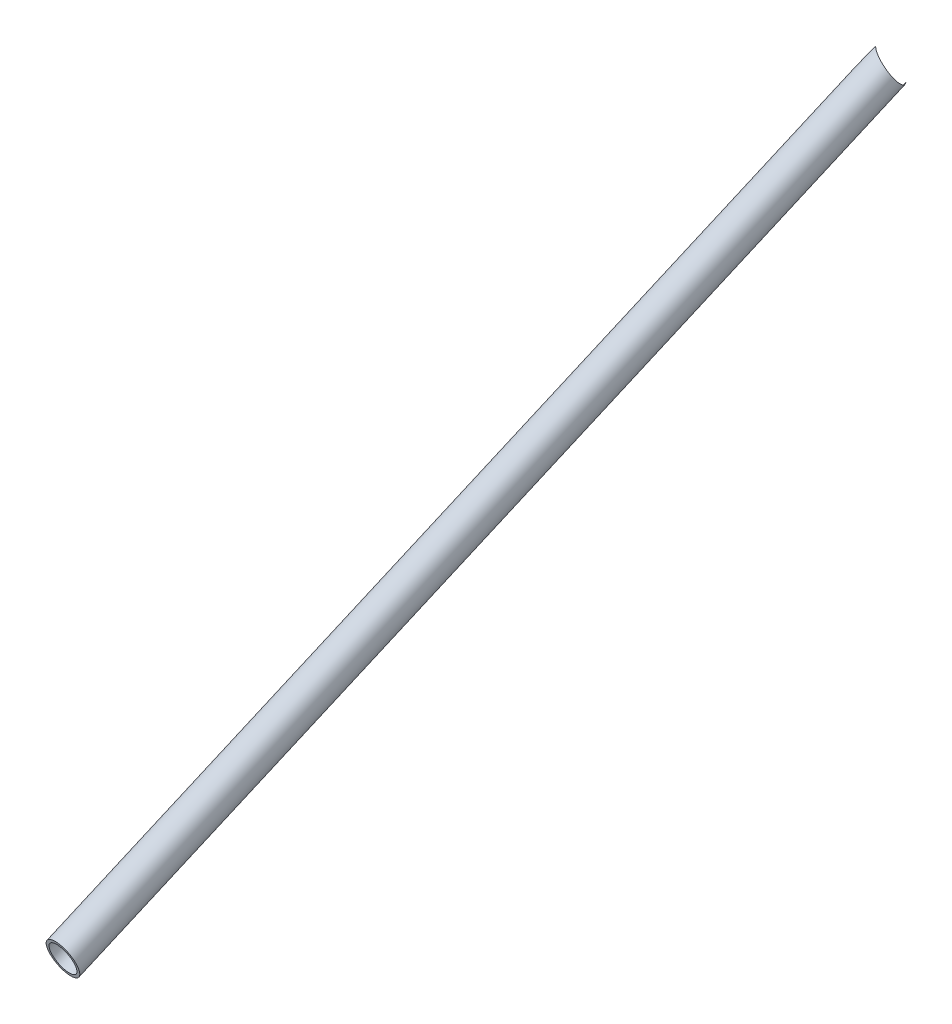
ISO-10303-21;
HEADER;
FILE_DESCRIPTION(('STEP AP214'),'2;1');
FILE_NAME('part.step','',(''),(''),'','','');
FILE_SCHEMA(('AUTOMOTIVE_DESIGN { 1 0 10303 214 1 1 1 1 }'));
ENDSEC;
DATA;
#1=APPLICATION_CONTEXT('core data for automotive mechanical design processes');
#2=APPLICATION_PROTOCOL_DEFINITION('international standard','automotive_design',2000,#1);
#3=PRODUCT_CONTEXT('',#1,'mechanical');
#4=PRODUCT('Part','Part','',(#3));
#5=PRODUCT_RELATED_PRODUCT_CATEGORY('part','',(#4));
#6=PRODUCT_DEFINITION_FORMATION('','',#4);
#7=PRODUCT_DEFINITION_CONTEXT('part definition',#1,'design');
#8=PRODUCT_DEFINITION('design','',#6,#7);
#9=PRODUCT_DEFINITION_SHAPE('','',#8);
#10=(LENGTH_UNIT() NAMED_UNIT(*) SI_UNIT(.MILLI.,.METRE.));
#11=(NAMED_UNIT(*) PLANE_ANGLE_UNIT() SI_UNIT($,.RADIAN.));
#12=(NAMED_UNIT(*) SI_UNIT($,.STERADIAN.) SOLID_ANGLE_UNIT());
#13=UNCERTAINTY_MEASURE_WITH_UNIT(LENGTH_MEASURE(1.E-05),#10,'distance_accuracy_value','');
#14=(GEOMETRIC_REPRESENTATION_CONTEXT(3) GLOBAL_UNCERTAINTY_ASSIGNED_CONTEXT((#13)) GLOBAL_UNIT_ASSIGNED_CONTEXT((#10,
#11,#12)) REPRESENTATION_CONTEXT('',''));
#15=CARTESIAN_POINT('',(0.,0.,0.));
#16=DIRECTION('',(0.,0.,1.));
#17=DIRECTION('',(1.,0.,0.));
#18=AXIS2_PLACEMENT_3D('',#15,#16,#17);
#19=CARTESIAN_POINT('',(-80.,380.,-601.037933611912));
#20=DIRECTION('',(-0.143388493553694,0.215082740330541,-0.966011984774675));
#21=DIRECTION('',(0.,0.976098519192531,0.21732850901377));
#22=AXIS2_PLACEMENT_3D('',#19,#20,#21);
#23=CYLINDRICAL_SURFACE('',#22,7.9);
#24=CARTESIAN_POINT('',(-158.980874678796,506.182490319815,-1131.41723116599));
#25=CARTESIAN_POINT('',(-158.748422493416,506.165280859311,-1131.33993661921));
#26=CARTESIAN_POINT('',(-158.51578375334,506.139324978695,-1131.26509855469));
#27=CARTESIAN_POINT('',(-158.05085961624,506.070144264024,-1131.12248687499));
#28=CARTESIAN_POINT('',(-157.818574273701,506.026916993956,-1131.05471425805));
#29=CARTESIAN_POINT('',(-157.355550379285,505.923232034948,-1130.92830625368));
#30=CARTESIAN_POINT('',(-157.124810730168,505.862788282871,-1130.86966353468));
#31=CARTESIAN_POINT('',(-156.665911350362,505.724513110719,-1130.76338194598));
#32=CARTESIAN_POINT('',(-156.437752163581,505.646678094134,-1130.71574535649));
#33=CARTESIAN_POINT('',(-156.026769345198,505.489234732048,-1130.6408697576));
#34=CARTESIAN_POINT('',(-155.843227857469,505.412507874493,-1130.61149830341));
#35=CARTESIAN_POINT('',(-155.480176339785,505.247346196125,-1130.56242663865));
#36=CARTESIAN_POINT('',(-155.300665475829,505.158913823976,-1130.54272440944));
#37=CARTESIAN_POINT('',(-154.947019554601,504.970486222036,-1130.51393818097));
#38=CARTESIAN_POINT('',(-154.772882070556,504.870496311742,-1130.50484931801));
#39=CARTESIAN_POINT('',(-154.431351834594,504.659200302302,-1130.49811183827));
#40=CARTESIAN_POINT('',(-154.263959132532,504.547894119533,-1130.50046330604));
#41=CARTESIAN_POINT('',(-153.936241727853,504.313565625078,-1130.51734529632));
#42=CARTESIAN_POINT('',(-153.775981532379,504.190459533921,-1130.53196965801));
#43=CARTESIAN_POINT('',(-153.465592539831,503.934040319588,-1130.57397207918));
#44=CARTESIAN_POINT('',(-153.315463804903,503.80072713381,-1130.60135021688));
#45=CARTESIAN_POINT('',(-153.027043537964,503.525016903228,-1130.66899273393));
#46=CARTESIAN_POINT('',(-152.888745985319,503.382624543787,-1130.70925050908));
#47=CARTESIAN_POINT('',(-152.625380845683,503.089993327712,-1130.8024678954));
#48=CARTESIAN_POINT('',(-152.500311750817,502.939755368299,-1130.85542605665));
#49=CARTESIAN_POINT('',(-152.279304778547,502.652048956018,-1130.96613726054));
#50=CARTESIAN_POINT('',(-152.181679051578,502.51532409052,-1131.02246907334));
#51=CARTESIAN_POINT('',(-151.9980581041,502.238012274893,-1131.14390223665));
#52=CARTESIAN_POINT('',(-151.9120629603,502.097425299299,-1131.209003645));
#53=CARTESIAN_POINT('',(-151.752091172815,501.813429684816,-1131.34727674451));
#54=CARTESIAN_POINT('',(-151.678114306358,501.670021098283,-1131.42044828605));
#55=CARTESIAN_POINT('',(-151.542340435112,501.381352532155,-1131.57406252496));
#56=CARTESIAN_POINT('',(-151.480544041078,501.236092460111,-1131.65450558663));
#57=CARTESIAN_POINT('',(-151.3683500505,500.942604931388,-1131.82295228781));
#58=CARTESIAN_POINT('',(-151.318120710568,500.794364123856,-1131.91104461104));
#59=CARTESIAN_POINT('',(-151.22996771825,500.497679938698,-1132.09289594302));
#60=CARTESIAN_POINT('',(-151.192048575173,500.349236506799,-1132.18665701337));
#61=CARTESIAN_POINT('',(-151.096363174337,499.904678060465,-1132.47505258995));
#62=CARTESIAN_POINT('',(-151.056604931555,499.609164363024,-1132.67689847923));
#63=CARTESIAN_POINT('',(-151.027009318083,499.108030467565,-1133.03282549319));
#64=CARTESIAN_POINT('',(-151.026150614893,498.900861011108,-1133.18406703947));
#65=CARTESIAN_POINT('',(-151.046081154677,498.490203092574,-1133.49027918341));
#66=CARTESIAN_POINT('',(-151.066878375311,498.286716015123,-1133.64525113473));
#67=CARTESIAN_POINT('',(-151.12911408724,497.883360722475,-1133.95697373531));
#68=CARTESIAN_POINT('',(-151.170615670929,497.683505515977,-1134.11372838133));
#69=CARTESIAN_POINT('',(-151.273351575584,497.288128290622,-1134.42614922199));
#70=CARTESIAN_POINT('',(-151.334583104956,497.092605662927,-1134.58181556744));
#71=CARTESIAN_POINT('',(-151.477291307675,496.702492604035,-1134.89198603882));
#72=CARTESIAN_POINT('',(-151.559080465093,496.507968819346,-1135.04643028565));
#73=CARTESIAN_POINT('',(-151.742094060311,496.122550973883,-1135.34839184753));
#74=CARTESIAN_POINT('',(-151.843326313071,495.931658406664,-1135.49590634748));
#75=CARTESIAN_POINT('',(-152.064908291022,495.553500951741,-1135.77939608306));
#76=CARTESIAN_POINT('',(-152.185194001432,495.366226192509,-1135.91540769821));
#77=CARTESIAN_POINT('',(-152.445266908332,494.99421000524,-1136.17087668216));
#78=CARTESIAN_POINT('',(-152.585033162882,494.809466087682,-1136.29035155696));
#79=CARTESIAN_POINT('',(-152.893783912685,494.430546977058,-1136.51233435381));
#80=CARTESIAN_POINT('',(-153.064035970498,494.236489704524,-1136.61334884004));
#81=CARTESIAN_POINT('',(-153.334994722179,493.948480302919,-1136.736708201));
#82=CARTESIAN_POINT('',(-153.427834733115,493.853061169945,-1136.77311728297));
#83=CARTESIAN_POINT('',(-153.618318999775,493.663604373153,-1136.83531927409));
#84=CARTESIAN_POINT('',(-153.715960814042,493.569566038224,-1136.86111751705));
#85=CARTESIAN_POINT('',(-153.916408505908,493.382530534701,-1136.90125101296));
#86=CARTESIAN_POINT('',(-154.019255722104,493.289552697283,-1136.91547105173));
#87=CARTESIAN_POINT('',(-154.228327047163,493.106363123688,-1136.93140241519));
#88=CARTESIAN_POINT('',(-154.33455096812,493.016151234139,-1136.93311443471));
#89=CARTESIAN_POINT('',(-154.54947761123,492.839220306072,-1136.92402546321));
#90=CARTESIAN_POINT('',(-154.658182221865,492.75250407774,-1136.91321460466));
#91=CARTESIAN_POINT('',(-154.877058976154,492.583340925093,-1136.87968165129));
#92=CARTESIAN_POINT('',(-154.987231341607,492.500894655449,-1136.85695773586));
#93=CARTESIAN_POINT('',(-155.228121841608,492.326437105805,-1136.79561846853));
#94=CARTESIAN_POINT('',(-155.358978304462,492.235365194174,-1136.75488283257));
#95=CARTESIAN_POINT('',(-155.620903914962,492.060386393249,-1136.66049728463));
#96=CARTESIAN_POINT('',(-155.751973148975,491.976485237847,-1136.60683716645));
#97=CARTESIAN_POINT('',(-156.014172523271,491.815921818922,-1136.48871210309));
#98=CARTESIAN_POINT('',(-156.145301912615,491.73927922931,-1136.42421903663));
#99=CARTESIAN_POINT('',(-156.407118355931,491.593546316604,-1136.28659414255));
#100=CARTESIAN_POINT('',(-156.537805507534,491.524454204699,-1136.21346436967));
#101=CARTESIAN_POINT('',(-156.877325038884,491.35446134408,-1136.01427251222));
#102=CARTESIAN_POINT('',(-157.085924176852,491.259395975852,-1135.88281008355));
#103=CARTESIAN_POINT('',(-157.502991678385,491.08825445179,-1135.60781466735));
#104=CARTESIAN_POINT('',(-157.711459897804,491.012189245292,-1135.46427478327));
#105=CARTESIAN_POINT('',(-158.129176014339,490.879094353012,-1135.16907492822));
#106=CARTESIAN_POINT('',(-158.338424596294,490.822091653419,-1135.01740379535));
#107=CARTESIAN_POINT('',(-158.757829735642,490.727733682633,-1134.70938515441));
#108=CARTESIAN_POINT('',(-158.967986097715,490.690374378419,-1134.55303861323));
#109=CARTESIAN_POINT('',(-159.398065362846,490.634958414545,-1134.2318764995));
#110=CARTESIAN_POINT('',(-159.618036172884,490.617753706621,-1134.06697607748));
#111=CARTESIAN_POINT('',(-160.059066648944,490.606686964055,-1133.73769606142));
#112=CARTESIAN_POINT('',(-160.280126509811,490.612829270111,-1133.57331656993));
#113=CARTESIAN_POINT('',(-160.722060133321,490.64989517408,-1133.24824283311));
#114=CARTESIAN_POINT('',(-160.942932926758,490.680755373606,-1133.08754024023));
#115=CARTESIAN_POINT('',(-161.383785824224,490.768765409068,-1132.77227052265));
#116=CARTESIAN_POINT('',(-161.603766331538,490.825901613233,-1132.61770026166));
#117=CARTESIAN_POINT('',(-161.972517567369,490.94567127577,-1132.36472377055));
#118=CARTESIAN_POINT('',(-162.122021071297,491.000983653371,-1132.26388411024));
#119=CARTESIAN_POINT('',(-162.4189469019,491.125073542279,-1132.06759848082));
#120=CARTESIAN_POINT('',(-162.566369779378,491.193847415424,-1131.97215106333));
#121=CARTESIAN_POINT('',(-162.858152748097,491.345075957674,-1131.78777244011));
#122=CARTESIAN_POINT('',(-163.002514228769,491.427524263902,-1131.69883823131));
#123=CARTESIAN_POINT('',(-163.287171876,491.606166040786,-1131.52853483376));
#124=CARTESIAN_POINT('',(-163.427467937796,491.702359865272,-1131.44716583984));
#125=CARTESIAN_POINT('',(-163.703721203594,491.908953261886,-1131.29254136327));
#126=CARTESIAN_POINT('',(-163.839643278878,492.019443196314,-1131.21934353914));
#127=CARTESIAN_POINT('',(-164.104897417919,492.253580662409,-1131.08266117689));
#128=CARTESIAN_POINT('',(-164.234229495544,492.377228166386,-1131.01917661834));
#129=CARTESIAN_POINT('',(-164.485026917843,492.636770167878,-1130.90272746577));
#130=CARTESIAN_POINT('',(-164.606494586375,492.772661018955,-1130.84975975447));
#131=CARTESIAN_POINT('',(-164.840469110936,493.055547228292,-1130.75487016977));
#132=CARTESIAN_POINT('',(-164.95297664066,493.202541750066,-1130.71294746537));
#133=CARTESIAN_POINT('',(-165.157250402344,493.490929286118,-1130.64406091202));
#134=CARTESIAN_POINT('',(-165.249964459411,493.631396501612,-1130.61601602021));
#135=CARTESIAN_POINT('',(-165.426890068598,493.919111586676,-1130.56904856357));
#136=CARTESIAN_POINT('',(-165.511098753602,494.066361718537,-1130.55012906681));
#137=CARTESIAN_POINT('',(-165.67058559253,494.36640709428,-1130.52124927677));
#138=CARTESIAN_POINT('',(-165.74586603146,494.519200906239,-1130.51128668682));
#139=CARTESIAN_POINT('',(-165.887339110678,494.829301576868,-1130.49997531099));
#140=CARTESIAN_POINT('',(-165.953528290073,494.986610126826,-1130.49862979663));
#141=CARTESIAN_POINT('',(-166.079262756525,495.311214061427,-1130.50422547366));
#142=CARTESIAN_POINT('',(-166.138420498884,495.478653519667,-1130.51151137695));
#143=CARTESIAN_POINT('',(-166.246832310388,495.816177196391,-1130.53433423959));
#144=CARTESIAN_POINT('',(-166.296082513719,495.986262419444,-1130.5498744111));
#145=CARTESIAN_POINT('',(-166.429136751585,496.49898757126,-1130.60789478333));
#146=CARTESIAN_POINT('',(-166.498315894443,496.844284294777,-1130.66177945441));
#147=CARTESIAN_POINT('',(-166.586315820291,497.446982475864,-1130.77725970174));
#148=CARTESIAN_POINT('',(-166.613480123988,497.704341306421,-1130.83338394945));
#149=CARTESIAN_POINT('',(-166.647813277251,498.217807237965,-1130.95693772571));
#150=CARTESIAN_POINT('',(-166.654973741181,498.473913769091,-1131.02437198288));
#151=CARTESIAN_POINT('',(-166.649805542723,498.984281784703,-1131.1683714198));
#152=CARTESIAN_POINT('',(-166.637407335262,499.238533441315,-1131.24496828333));
#153=CARTESIAN_POINT('',(-166.593256902156,499.743251586696,-1131.40457893405));
#154=CARTESIAN_POINT('',(-166.561507899682,499.993718698719,-1131.48759165056));
#155=CARTESIAN_POINT('',(-166.477662128002,500.495016478938,-1131.65899958326));
#156=CARTESIAN_POINT('',(-166.425176590183,500.745756986373,-1131.7474686447));
#157=CARTESIAN_POINT('',(-166.299087537952,501.241847720082,-1131.92495543503));
#158=CARTESIAN_POINT('',(-166.225473923007,501.487195307666,-1132.01397340635));
#159=CARTESIAN_POINT('',(-166.055935994133,501.97039882274,-1132.18797911348));
#160=CARTESIAN_POINT('',(-165.960102704975,502.208280936994,-1132.27298163342));
#161=CARTESIAN_POINT('',(-165.743843565098,502.675577049539,-1132.43380691372));
#162=CARTESIAN_POINT('',(-165.623448893476,502.905001352771,-1132.50964112019));
#163=CARTESIAN_POINT('',(-165.352868052783,503.356464959361,-1132.64625460328));
#164=CARTESIAN_POINT('',(-165.202224738637,503.578320896633,-1132.7067659404));
#165=CARTESIAN_POINT('',(-164.953960397218,503.897641676638,-1132.77828524019));
#166=CARTESIAN_POINT('',(-164.867566152935,504.001761063322,-1132.798908335));
#167=CARTESIAN_POINT('',(-164.687413877323,504.2046604248,-1132.83278752891));
#168=CARTESIAN_POINT('',(-164.593659403671,504.303442940742,-1132.84604716254));
#169=CARTESIAN_POINT('',(-164.398281589876,504.495545685038,-1132.86452995923));
#170=CARTESIAN_POINT('',(-164.2965954025,504.588809193936,-1132.86968022616));
#171=CARTESIAN_POINT('',(-164.086837158996,504.767937504002,-1132.87135728586));
#172=CARTESIAN_POINT('',(-163.978765374051,504.853802618982,-1132.86788444458));
#173=CARTESIAN_POINT('',(-163.757110685209,505.017479809068,-1132.85245689869));
#174=CARTESIAN_POINT('',(-163.643522537678,505.095283992655,-1132.8404939707));
#175=CARTESIAN_POINT('',(-163.411961294964,505.242378015465,-1132.80869996644));
#176=CARTESIAN_POINT('',(-163.293985839276,505.311663182282,-1132.78886459738));
#177=CARTESIAN_POINT('',(-163.030228581012,505.454911306473,-1132.73752247344));
#178=CARTESIAN_POINT('',(-162.883696185515,505.526930986708,-1132.70445808523));
#179=CARTESIAN_POINT('',(-162.587192252156,505.658889562717,-1132.63028111077));
#180=CARTESIAN_POINT('',(-162.437217989446,505.718818491317,-1132.58916193902));
#181=CARTESIAN_POINT('',(-162.134644627248,505.827356513408,-1132.50079554249));
#182=CARTESIAN_POINT('',(-161.982040542285,505.875940785335,-1132.45353522613));
#183=CARTESIAN_POINT('',(-161.675272339979,505.962391839457,-1132.35478045038));
#184=CARTESIAN_POINT('',(-161.521108711378,506.000261877802,-1132.30328728356));
#185=CARTESIAN_POINT('',(-161.170095306499,506.074864108371,-1132.18343159224));
#186=CARTESIAN_POINT('',(-160.972883362474,506.108568659449,-1132.11424788763));
#187=CARTESIAN_POINT('',(-160.577113236864,506.161185011086,-1131.97414673754));
#188=CARTESIAN_POINT('',(-160.378554809807,506.180094036998,-1131.90322896942));
#189=CARTESIAN_POINT('',(-159.980473335758,506.203998129875,-1131.76176238505));
#190=CARTESIAN_POINT('',(-159.78095025217,506.208992664768,-1131.69121358301));
#191=CARTESIAN_POINT('',(-159.381289161778,506.205652357781,-1131.55224575846));
#192=CARTESIAN_POINT('',(-159.181151162165,506.19731767119,-1131.48382671116));
#193=CARTESIAN_POINT('',(-158.980874678796,506.182490319815,-1131.41723116599));
#194=B_SPLINE_CURVE_WITH_KNOTS('',3,(#24,#25,#26,#27,#28,#29,#30,#31,#32,#33,#34,#35,#36,#37,
#38,#39,#40,#41,#42,#43,#44,#45,#46,#47,#48,#49,#50,#51,#52,#53,#54,#55,#56,#57,#58,#59,#60,#61,
#62,#63,#64,#65,#66,#67,#68,#69,#70,#71,#72,#73,#74,#75,#76,#77,#78,#79,#80,#81,#82,#83,#84,#85,
#86,#87,#88,#89,#90,#91,#92,#93,#94,#95,#96,#97,#98,#99,#100,#101,#102,#103,#104,#105,#106,#107,
#108,#109,#110,#111,#112,#113,#114,#115,#116,#117,#118,#119,#120,#121,#122,#123,#124,#125,#126,
#127,#128,#129,#130,#131,#132,#133,#134,#135,#136,#137,#138,#139,#140,#141,#142,#143,#144,#145,
#146,#147,#148,#149,#150,#151,#152,#153,#154,#155,#156,#157,#158,#159,#160,#161,#162,#163,#164,
#165,#166,#167,#168,#169,#170,#171,#172,#173,#174,#175,#176,#177,#178,#179,#180,#181,#182,#183,
#184,#185,#186,#187,#188,#189,#190,#191,#192,#193),.UNSPECIFIED.,.T.,.F.,(4,2,2,2,2,2,2,2,2,2,2,
2,2,2,2,2,2,2,2,2,2,2,2,2,2,2,2,2,2,2,2,2,2,2,2,2,2,2,2,2,2,2,2,2,2,2,2,2,2,2,2,2,2,2,2,2,2,2,2,
2,2,2,2,2,2,2,2,2,2,2,2,2,2,2,2,2,2,2,2,2,2,2,2,2,4),(0.,0.736563212021213,1.47323034800812,
2.20930283334145,2.94552767945863,3.54823641893139,4.15081927715671,4.75312588559729,
5.35543694524709,5.96239571519076,6.5693582079101,7.17600997003768,7.78259250692402,
8.31354080692214,8.84449260858844,9.37543456735184,9.9064031418786,10.4446660384368,
10.9831258824472,12.059429484306,12.8280675026897,13.5969887739659,14.3682676238247,
15.1394373931152,15.9231247074559,16.7071276789131,17.4885503870634,18.2691394394435,
19.0976874810976,19.5113341439903,19.9247726216238,20.3422765854863,20.759757356658,
21.1775673097519,21.5954411330769,22.0883201434304,22.5815896533788,23.0761600129456,
23.5706129469376,24.3621957236857,25.1542336235533,25.9473880861468,26.740379641151,
27.5658037902386,28.3913814104645,29.214848279456,30.0378884218597,30.6032598929606,
31.1684787747185,31.733435387401,32.2984065454921,32.8671412313767,33.4358747203653,
34.0044393797796,34.5729612494831,35.0842501629994,35.5957108580668,36.1070403711913,
36.6185640027165,37.1512242752523,37.6840919846974,38.7492312423242,39.5427237627213,
40.3365488663393,41.133202954345,41.9297243836677,42.741947257185,43.5545590723024,
44.3638990029709,45.1722178511624,45.9938227189408,46.4039770650926,46.8139343633945,
47.2275562007444,47.6411604850761,48.0551659292183,48.4693974385754,48.9683806383626,
49.4677735158558,49.9682490116178,50.4685722446466,51.1030455925914,51.7376378966681,
52.372254466359,53.0068636426095),.UNSPECIFIED.);
#195=CARTESIAN_POINT('',(-157.707787846155,506.00131210819,-1131.02485880949));
#196=VERTEX_POINT('',#195);
#197=CARTESIAN_POINT('',(-151.072943904297,498.265752882407,-1133.66208464777));
#198=VERTEX_POINT('',#197);
#199=EDGE_CURVE('E112',#196,#198,#194,.T.);
#200=ORIENTED_EDGE('',*,*,#199,.T.);
#201=CARTESIAN_POINT('',(-158.796682649508,505.906202275883,-1130.17632470702));
#202=CARTESIAN_POINT('',(-158.655949472796,505.934290752738,-1130.30247702826));
#203=CARTESIAN_POINT('',(-158.51074488182,505.956692768521,-1130.42488540556));
#204=CARTESIAN_POINT('',(-158.212847053892,505.988802535162,-1130.6620059837));
#205=CARTESIAN_POINT('',(-158.060154674531,505.998511736246,-1130.77671906235));
#206=CARTESIAN_POINT('',(-157.748980639847,506.004213032797,-1130.99852394063));
#207=CARTESIAN_POINT('',(-157.590496316752,506.00019872638,-1131.10561215956));
#208=CARTESIAN_POINT('',(-157.269745853981,505.977766618322,-1131.31236790157));
#209=CARTESIAN_POINT('',(-157.107479535013,505.95934813247,-1131.41203507189));
#210=CARTESIAN_POINT('',(-156.781436347104,505.907820900211,-1131.6041858366));
#211=CARTESIAN_POINT('',(-156.617662622107,505.874737943296,-1131.69668170866));
#212=CARTESIAN_POINT('',(-156.290216454825,505.793853473473,-1131.87517305817));
#213=CARTESIAN_POINT('',(-156.126544012545,505.7460519599,-1131.96116853532));
#214=CARTESIAN_POINT('',(-155.801011255605,505.635915189359,-1132.12717817137));
#215=CARTESIAN_POINT('',(-155.639151463094,505.57357585205,-1132.20719064268));
#216=CARTESIAN_POINT('',(-155.318885862955,505.434749919739,-1132.36165382116));
#217=CARTESIAN_POINT('',(-155.160480117518,505.358263070241,-1132.43610442826));
#218=CARTESIAN_POINT('',(-154.845872905788,505.190220780951,-1132.58103544111));
#219=CARTESIAN_POINT('',(-154.689756222975,505.098428777701,-1132.65142552787));
#220=CARTESIAN_POINT('',(-154.383924734152,504.901381778846,-1132.78707201279));
#221=CARTESIAN_POINT('',(-154.234209962002,504.796126712046,-1132.85232838381));
#222=CARTESIAN_POINT('',(-153.942363437318,504.572873243375,-1132.97782955723));
#223=CARTESIAN_POINT('',(-153.800232048221,504.454874231563,-1133.0380741195));
#224=CARTESIAN_POINT('',(-153.524606690152,504.206926993822,-1133.15352567781));
#225=CARTESIAN_POINT('',(-153.391112938148,504.076978467931,-1133.20873254731));
#226=CARTESIAN_POINT('',(-153.127945176685,503.799938916634,-1133.31628591234));
#227=CARTESIAN_POINT('',(-152.998706232291,503.652342119692,-1133.36839543369));
#228=CARTESIAN_POINT('',(-152.751559111525,503.346063095305,-1133.46657425604));
#229=CARTESIAN_POINT('',(-152.633651290769,503.187380520215,-1133.5126433675));
#230=CARTESIAN_POINT('',(-152.409899899974,502.859990897778,-1133.59821362434));
#231=CARTESIAN_POINT('',(-152.304059193505,502.691281485416,-1133.63771321177));
#232=CARTESIAN_POINT('',(-152.105084709775,502.345047917511,-1133.70941859426));
#233=CARTESIAN_POINT('',(-152.011950866182,502.167523807988,-1133.74162442741));
#234=CARTESIAN_POINT('',(-151.838322416505,501.80384104111,-1133.79802605217));
#235=CARTESIAN_POINT('',(-151.757906373345,501.617637263447,-1133.82217300584));
#236=CARTESIAN_POINT('',(-151.610660313879,501.238976626702,-1133.86112600312));
#237=CARTESIAN_POINT('',(-151.54383044591,501.046519699373,-1133.87593194474));
#238=CARTESIAN_POINT('',(-151.423841686602,500.656948910048,-1133.89499159964));
#239=CARTESIAN_POINT('',(-151.37067781576,500.459836772945,-1133.89924916136));
#240=CARTESIAN_POINT('',(-151.277804574754,500.06256310437,-1133.89592297511));
#241=CARTESIAN_POINT('',(-151.238094625024,499.862401704643,-1133.88833973731));
#242=CARTESIAN_POINT('',(-151.172763006875,499.467587996433,-1133.86049831488));
#243=CARTESIAN_POINT('',(-151.146713684899,499.272975944851,-1133.84067355196));
#244=CARTESIAN_POINT('',(-151.106011251413,498.884380097812,-1133.78765747002));
#245=CARTESIAN_POINT('',(-151.091357675827,498.690396277092,-1133.75446669542));
#246=CARTESIAN_POINT('',(-151.072430835209,498.305000675803,-1133.67388928616));
#247=CARTESIAN_POINT('',(-151.068151592102,498.113587477219,-1133.62651084466));
#248=CARTESIAN_POINT('',(-151.068658918687,497.735025417171,-1133.51706997451));
#249=CARTESIAN_POINT('',(-151.073445164232,497.547876403478,-1133.45500807095));
#250=CARTESIAN_POINT('',(-151.090108182469,497.18947362155,-1133.31996963164));
#251=CARTESIAN_POINT('',(-151.101586350315,497.017908244986,-1133.24776753636));
#252=CARTESIAN_POINT('',(-151.129940481607,496.68116191726,-1133.0906470593));
#253=CARTESIAN_POINT('',(-151.146816933481,496.515981545319,-1133.00572752725));
#254=CARTESIAN_POINT('',(-151.184616951617,496.192887891397,-1132.82399923264));
#255=CARTESIAN_POINT('',(-151.205538929492,496.034971787287,-1132.72719514172));
#256=CARTESIAN_POINT('',(-151.250209146299,495.726764775139,-1132.52272913137));
#257=CARTESIAN_POINT('',(-151.273957782584,495.576474943399,-1132.41506568573));
#258=CARTESIAN_POINT('',(-151.336961839792,495.201870313819,-1132.12724764549));
#259=CARTESIAN_POINT('',(-151.377473389131,494.983063060762,-1131.94017498994));
#260=CARTESIAN_POINT('',(-151.459727709582,494.563355750328,-1131.54717185671));
#261=CARTESIAN_POINT('',(-151.501471236196,494.362466998356,-1131.34122963736));
#262=CARTESIAN_POINT('',(-151.584467151969,493.976041592357,-1130.91379711687));
#263=CARTESIAN_POINT('',(-151.625716733252,493.790573137722,-1130.69224500318));
#264=CARTESIAN_POINT('',(-151.686288236948,493.523072570002,-1130.35146541459));
#265=CARTESIAN_POINT('',(-151.70625936436,493.435698863751,-1130.23647740321));
#266=CARTESIAN_POINT('',(-151.745705879113,493.264232040802,-1130.00399709341));
#267=CARTESIAN_POINT('',(-151.765181273344,493.180138878508,-1129.88650482983));
#268=CARTESIAN_POINT('',(-151.821051160891,492.939847373232,-1129.54143929679));
#269=CARTESIAN_POINT('',(-151.856719697593,492.787647981151,-1129.31095832547));
#270=CARTESIAN_POINT('',(-151.925919586513,492.492654037526,-1128.84371364252));
#271=CARTESIAN_POINT('',(-151.959450429513,492.349861726564,-1128.60694845282));
#272=CARTESIAN_POINT('',(-152.024430908578,492.07221962303,-1128.12828034353));
#273=CARTESIAN_POINT('',(-152.055878814586,491.937376442859,-1127.88637336814));
#274=CARTESIAN_POINT('',(-152.116787472019,491.674588774778,-1127.39858094455));
#275=CARTESIAN_POINT('',(-152.146248034722,491.546644942275,-1127.15269512125));
#276=CARTESIAN_POINT('',(-152.203440718383,491.296279331082,-1126.65688037494));
#277=CARTESIAN_POINT('',(-152.231166638125,491.173877753215,-1126.4069405676));
#278=CARTESIAN_POINT('',(-152.284962804897,490.934258135115,-1125.90440680067));
#279=CARTESIAN_POINT('',(-152.31103297403,490.817040338837,-1125.65181271687));
#280=CARTESIAN_POINT('',(-152.387010948849,490.472250353205,-1124.89100474289));
#281=CARTESIAN_POINT('',(-152.434714721188,490.25141662721,-1124.37951385185));
#282=CARTESIAN_POINT('',(-152.525958210295,489.821990940054,-1123.34623880389));
#283=CARTESIAN_POINT('',(-152.569461217811,489.613512147291,-1122.82440489167));
#284=CARTESIAN_POINT('',(-152.653043425901,489.207915975649,-1121.7760317384));
#285=CARTESIAN_POINT('',(-152.693122322696,489.010799605324,-1121.24949208443));
#286=CARTESIAN_POINT('',(-152.770742170074,488.626369110439,-1120.19393480704));
#287=CARTESIAN_POINT('',(-152.80828827953,488.439035247972,-1119.66492472113));
#288=CARTESIAN_POINT('',(-152.881731907634,488.07232835112,-1118.60403429519));
#289=CARTESIAN_POINT('',(-152.917629390708,487.892955488513,-1118.0721538935));
#290=CARTESIAN_POINT('',(-153.005187740543,487.45800110018,-1116.75405180769));
#291=CARTESIAN_POINT('',(-153.056278525159,487.206477353837,-1115.96645341));
#292=CARTESIAN_POINT('',(-153.158107515141,486.716350368346,-1114.38721487494));
#293=CARTESIAN_POINT('',(-153.20884571029,486.477747502246,-1113.5955746216));
#294=CARTESIAN_POINT('',(-153.31146387687,486.012076434118,-1112.00830857372));
#295=CARTESIAN_POINT('',(-153.363344712346,485.785017422804,-1111.21268014089));
#296=CARTESIAN_POINT('',(-153.469513161186,485.342045111565,-1109.61849970847));
#297=CARTESIAN_POINT('',(-153.523800740476,485.126131653943,-1108.8199477504));
#298=CARTESIAN_POINT('',(-153.63581110579,484.706215355805,-1107.22342285419));
#299=CARTESIAN_POINT('',(-153.693519119041,484.502167898206,-1106.42546062331));
#300=CARTESIAN_POINT('',(-153.813863096953,484.105420454115,-1104.82706798389));
#301=CARTESIAN_POINT('',(-153.876499154614,483.912720681893,-1104.02663752906));
#302=CARTESIAN_POINT('',(-154.008131714932,483.539667258394,-1102.42390111674));
#303=CARTESIAN_POINT('',(-154.077124588751,483.359306664426,-1101.62159648101));
#304=CARTESIAN_POINT('',(-154.223290149276,483.012322931434,-1100.01477478067));
#305=CARTESIAN_POINT('',(-154.300462450937,482.845699146408,-1099.21025782195));
#306=CARTESIAN_POINT('',(-154.424341625948,482.607623496488,-1098.00032684742));
#307=CARTESIAN_POINT('',(-154.467079695756,482.530101741236,-1097.59569640292));
#308=CARTESIAN_POINT('',(-154.555641098542,482.379609915945,-1096.78592943111));
#309=CARTESIAN_POINT('',(-154.601464382126,482.306639773068,-1096.380792912));
#310=CARTESIAN_POINT('',(-154.696722753732,482.165768283291,-1095.56973908842));
#311=CARTESIAN_POINT('',(-154.746160550951,482.097870817214,-1095.163821425));
#312=CARTESIAN_POINT('',(-154.849243289007,481.967967151444,-1094.35158430975));
#313=CARTESIAN_POINT('',(-154.902888102547,481.905960773621,-1093.94526487046));
#314=CARTESIAN_POINT('',(-155.015172511582,481.788887455004,-1093.13253867344));
#315=CARTESIAN_POINT('',(-155.073809322535,481.733816687478,-1092.72613208889));
#316=CARTESIAN_POINT('',(-155.197208895926,481.631997487592,-1091.91321987626));
#317=CARTESIAN_POINT('',(-155.261971284979,481.585248548476,-1091.50671425573));
#318=CARTESIAN_POINT('',(-155.39910464494,481.502144513156,-1090.69434651878));
#319=CARTESIAN_POINT('',(-155.471466968349,481.465777775243,-1090.28848419311));
#320=CARTESIAN_POINT('',(-155.587533928901,481.421380111381,-1089.68044331255));
#321=CARTESIAN_POINT('',(-155.627471303355,481.408273979535,-1089.47791401346));
#322=CARTESIAN_POINT('',(-155.710289614301,481.386036394197,-1089.07324343379));
#323=CARTESIAN_POINT('',(-155.753170377025,481.3769047063,-1088.87110213104));
#324=CARTESIAN_POINT('',(-155.842557430639,481.36334489538,-1088.46679084598));
#325=CARTESIAN_POINT('',(-155.889074640478,481.358931571419,-1088.26462275101));
#326=CARTESIAN_POINT('',(-155.986369560184,481.355899785769,-1087.86118424368));
#327=CARTESIAN_POINT('',(-156.037148576153,481.357283106961,-1087.65991412657));
#328=CARTESIAN_POINT('',(-156.143802257594,481.367309310783,-1087.25958572544));
#329=CARTESIAN_POINT('',(-156.199659828237,481.375928588421,-1087.06052237928));
#330=CARTESIAN_POINT('',(-156.318027314087,481.402534816282,-1086.66505878431));
#331=CARTESIAN_POINT('',(-156.380533027703,481.42051587757,-1086.46865694091));
#332=CARTESIAN_POINT('',(-156.495379215677,481.462324449648,-1086.13564548304));
#333=CARTESIAN_POINT('',(-156.545557483434,481.483036426543,-1085.99791154585));
#334=CARTESIAN_POINT('',(-156.651766487647,481.532996164747,-1085.72587223862));
#335=CARTESIAN_POINT('',(-156.707808799043,481.56226102055,-1085.59157432646));
#336=CARTESIAN_POINT('',(-156.827804439363,481.632426478944,-1085.32798993658));
#337=CARTESIAN_POINT('',(-156.891826488945,481.673432755263,-1085.19876167547));
#338=CARTESIAN_POINT('',(-157.029457242316,481.771224113138,-1084.95181737162));
#339=CARTESIAN_POINT('',(-157.103031068962,481.827952602846,-1084.83406204934));
#340=CARTESIAN_POINT('',(-157.226152762159,481.932479360093,-1084.66779472333));
#341=CARTESIAN_POINT('',(-157.271760521431,481.972955597827,-1084.61184141878));
#342=CARTESIAN_POINT('',(-157.36638292056,482.061119622596,-1084.50920722389));
#343=CARTESIAN_POINT('',(-157.415393795977,482.108799507712,-1084.46251630155));
#344=CARTESIAN_POINT('',(-157.51666829789,482.211970568637,-1084.38097160193));
#345=CARTESIAN_POINT('',(-157.568961662086,482.267541550592,-1084.34625301969));
#346=CARTESIAN_POINT('',(-157.674607828071,482.384743403203,-1084.29197686202));
#347=CARTESIAN_POINT('',(-157.727959852701,482.446369950917,-1084.27240855846));
#348=CARTESIAN_POINT('',(-157.827622590305,482.565969795362,-1084.25025866639));
#349=CARTESIAN_POINT('',(-157.874041415722,482.623556161892,-1084.24599189325));
#350=CARTESIAN_POINT('',(-157.965052567218,482.739884024421,-1084.24862130198));
#351=CARTESIAN_POINT('',(-158.009643311167,482.798626458492,-1084.25552695239));
#352=CARTESIAN_POINT('',(-158.120654718446,482.948772581604,-1084.28525573985));
#353=CARTESIAN_POINT('',(-158.185350689637,483.0400852545,-1084.31481706945));
#354=CARTESIAN_POINT('',(-158.308665808036,483.220058416669,-1084.39016589));
#355=CARTESIAN_POINT('',(-158.36726579276,483.308709954285,-1084.43600266104));
#356=CARTESIAN_POINT('',(-158.478061468897,483.481127874525,-1084.53804564774));
#357=CARTESIAN_POINT('',(-158.530351894292,483.564952844315,-1084.59405469228));
#358=CARTESIAN_POINT('',(-158.63059644721,483.729570037478,-1084.71394911672));
#359=CARTESIAN_POINT('',(-158.678545963704,483.810358983857,-1084.77784270548));
#360=CARTESIAN_POINT('',(-158.770917170013,483.969340019289,-1084.9116002756));
#361=CARTESIAN_POINT('',(-158.81532923554,484.047524708252,-1084.98147953868));
#362=CARTESIAN_POINT('',(-158.901056330923,484.201361706794,-1085.12565224559));
#363=CARTESIAN_POINT('',(-158.942372901597,484.277015265753,-1085.19994345985));
#364=CARTESIAN_POINT('',(-159.055685979893,484.488118281065,-1085.41517251973));
#365=CARTESIAN_POINT('',(-159.124650175568,484.621022147568,-1085.56019749217));
#366=CARTESIAN_POINT('',(-159.256043437587,484.881101655269,-1085.85818200348));
#367=CARTESIAN_POINT('',(-159.318468170246,485.008273466447,-1086.01114670483));
#368=CARTESIAN_POINT('',(-159.438245160902,485.258169565205,-1086.3231372291));
#369=CARTESIAN_POINT('',(-159.49558658577,485.380884040255,-1086.48217500987));
#370=CARTESIAN_POINT('',(-159.606031672492,485.622407907921,-1086.80463273954));
#371=CARTESIAN_POINT('',(-159.659134829707,485.741216834528,-1086.96805320718));
#372=CARTESIAN_POINT('',(-159.762021155115,485.976027317379,-1087.29903479119));
#373=CARTESIAN_POINT('',(-159.811789165817,486.092014706842,-1087.46661061789));
#374=CARTESIAN_POINT('',(-159.908291831575,486.32113470641,-1087.8045694854));
#375=CARTESIAN_POINT('',(-159.955026320211,486.434267159685,-1087.97495267956));
#376=CARTESIAN_POINT('',(-160.045803153492,486.657883053659,-1088.31778291591));
#377=CARTESIAN_POINT('',(-160.089849303357,486.768370097448,-1088.49022660741));
#378=CARTESIAN_POINT('',(-160.175639150192,486.987156898658,-1088.83705237833));
#379=CARTESIAN_POINT('',(-160.217382902315,487.095456708435,-1089.0114344112));
#380=CARTESIAN_POINT('',(-160.338491859521,487.414644257984,-1089.53247151938));
#381=CARTESIAN_POINT('',(-160.41490922722,487.622736419383,-1089.88152742924));
#382=CARTESIAN_POINT('',(-160.561282231227,488.032827216974,-1090.58455430867));
#383=CARTESIAN_POINT('',(-160.631237241246,488.234825261289,-1090.9385257508));
#384=CARTESIAN_POINT('',(-160.765706357066,488.633784438267,-1091.65046204455));
#385=CARTESIAN_POINT('',(-160.830218741764,488.830743963998,-1092.00842811916));
#386=CARTESIAN_POINT('',(-160.954517411124,489.220328394143,-1092.72753285036));
#387=CARTESIAN_POINT('',(-161.01430354126,489.412953156682,-1093.08867161025));
#388=CARTESIAN_POINT('',(-161.129804745584,489.794804550699,-1093.8142522519));
#389=CARTESIAN_POINT('',(-161.185512106262,489.98402425798,-1094.1786989981));
#390=CARTESIAN_POINT('',(-161.293152662982,490.359170575058,-1094.90984044071));
#391=CARTESIAN_POINT('',(-161.34508579855,490.545097132055,-1095.27653517305));
#392=CARTESIAN_POINT('',(-161.495710522045,491.098455385982,-1096.37935683362));
#393=CARTESIAN_POINT('',(-161.589250992332,491.461544210846,-1097.11837140643));
#394=CARTESIAN_POINT('',(-161.764660698244,492.179587739758,-1098.60452633636));
#395=CARTESIAN_POINT('',(-161.846493097598,492.534513945032,-1099.35168471074));
#396=CARTESIAN_POINT('',(-161.999171665215,493.236827931474,-1100.85068776528));
#397=CARTESIAN_POINT('',(-162.07001732426,493.584215362591,-1101.60253266097));
#398=CARTESIAN_POINT('',(-162.201108280349,494.272289610811,-1103.10879011123));
#399=CARTESIAN_POINT('',(-162.261369701761,494.612985905544,-1103.86319694365));
#400=CARTESIAN_POINT('',(-162.371449400683,495.28938108275,-1105.37498104532));
#401=CARTESIAN_POINT('',(-162.42126795186,495.625080095969,-1106.1323582362));
#402=CARTESIAN_POINT('',(-162.510089682513,496.292995031891,-1107.65051264863));
#403=CARTESIAN_POINT('',(-162.549078067028,496.625205599127,-1108.41129309263));
#404=CARTESIAN_POINT('',(-162.615177745053,497.286715623196,-1109.93468846584));
#405=CARTESIAN_POINT('',(-162.642288397249,497.616014921901,-1110.69730349186));
#406=CARTESIAN_POINT('',(-162.682993605348,498.27366242436,-1112.22589032029));
#407=CARTESIAN_POINT('',(-162.696549400841,498.602005238761,-1112.99186549376));
#408=CARTESIAN_POINT('',(-162.707285645023,499.257873948712,-1114.52416967217));
#409=CARTESIAN_POINT('',(-162.70446880788,499.58539997066,-1115.2904985974));
#410=CARTESIAN_POINT('',(-162.684673798719,500.075354634563,-1116.43566337007));
#411=CARTESIAN_POINT('',(-162.675567185155,500.237613363127,-1116.81471108018));
#412=CARTESIAN_POINT('',(-162.651447905949,500.562396467852,-1117.5725012638));
#413=CARTESIAN_POINT('',(-162.636435364658,500.724920838348,-1117.95124374356));
#414=CARTESIAN_POINT('',(-162.599511386792,501.050507588234,-1118.70850388003));
#415=CARTESIAN_POINT('',(-162.577594792976,501.213570279347,-1119.08702115605));
#416=CARTESIAN_POINT('',(-162.525584015564,501.540236686797,-1119.84325809531));
#417=CARTESIAN_POINT('',(-162.495490062474,501.703840387756,-1120.22097778072));
#418=CARTESIAN_POINT('',(-162.425610989074,502.030912443417,-1120.97350422572));
#419=CARTESIAN_POINT('',(-162.385871307925,502.194377928133,-1121.34831637945));
#420=CARTESIAN_POINT('',(-162.29444041877,502.521920351966,-1122.09630472928));
#421=CARTESIAN_POINT('',(-162.242747585304,502.685997371254,-1122.46948069583));
#422=CARTESIAN_POINT('',(-162.124586536425,503.014265039181,-1123.21284717905));
#423=CARTESIAN_POINT('',(-162.058138557684,503.178455228058,-1123.58304107185));
#424=CARTESIAN_POINT('',(-161.906583184772,503.506485668551,-1124.31969764953));
#425=CARTESIAN_POINT('',(-161.821483167104,503.670326032723,-1124.68616174967));
#426=CARTESIAN_POINT('',(-161.689888593932,503.891338351307,-1125.17951772302));
#427=CARTESIAN_POINT('',(-161.653784573785,503.949315375344,-1125.30884436562));
#428=CARTESIAN_POINT('',(-161.57825288563,504.064927029566,-1125.5666909138));
#429=CARTESIAN_POINT('',(-161.538825047506,504.122561642063,-1125.69521077772));
#430=CARTESIAN_POINT('',(-161.456335499944,504.237370044878,-1125.95134639894));
#431=CARTESIAN_POINT('',(-161.413272608478,504.294543678624,-1126.07896184741));
#432=CARTESIAN_POINT('',(-161.323199700023,504.408232209719,-1126.33308246248));
#433=CARTESIAN_POINT('',(-161.276189722545,504.464747113656,-1126.45958764019));
#434=CARTESIAN_POINT('',(-161.128874961129,504.632826886559,-1126.83679140077));
#435=CARTESIAN_POINT('',(-161.022150106063,504.743119474746,-1127.08560623958));
#436=CARTESIAN_POINT('',(-160.788710789526,504.9579296935,-1127.5762893184));
#437=CARTESIAN_POINT('',(-160.662001566711,505.062448827838,-1127.8181593593));
#438=CARTESIAN_POINT('',(-160.411572512387,505.243688622104,-1128.24849161665));
#439=CARTESIAN_POINT('',(-160.291683128154,505.321963140589,-1128.43851759801));
#440=CARTESIAN_POINT('',(-160.035796577297,505.469968134516,-1128.81096604021));
#441=CARTESIAN_POINT('',(-159.899800791223,505.539699341202,-1128.99338915091));
#442=CARTESIAN_POINT('',(-159.611594808633,505.667612387444,-1129.34878695761));
#443=CARTESIAN_POINT('',(-159.459412265824,505.72581345326,-1129.52177702779));
#444=CARTESIAN_POINT('',(-159.139343447883,505.827664742099,-1129.85720929394));
#445=CARTESIAN_POINT('',(-158.97146129822,505.871318774039,-1130.019654242));
#446=CARTESIAN_POINT('',(-158.796682649508,505.906202275883,-1130.17632470702));
#447=B_SPLINE_CURVE_WITH_KNOTS('',3,(#201,#202,#203,#204,#205,#206,#207,#208,#209,#210,#211,
#212,#213,#214,#215,#216,#217,#218,#219,#220,#221,#222,#223,#224,#225,#226,#227,#228,#229,#230,
#231,#232,#233,#234,#235,#236,#237,#238,#239,#240,#241,#242,#243,#244,#245,#246,#247,#248,#249,
#250,#251,#252,#253,#254,#255,#256,#257,#258,#259,#260,#261,#262,#263,#264,#265,#266,#267,#268,
#269,#270,#271,#272,#273,#274,#275,#276,#277,#278,#279,#280,#281,#282,#283,#284,#285,#286,#287,
#288,#289,#290,#291,#292,#293,#294,#295,#296,#297,#298,#299,#300,#301,#302,#303,#304,#305,#306,
#307,#308,#309,#310,#311,#312,#313,#314,#315,#316,#317,#318,#319,#320,#321,#322,#323,#324,#325,
#326,#327,#328,#329,#330,#331,#332,#333,#334,#335,#336,#337,#338,#339,#340,#341,#342,#343,#344,
#345,#346,#347,#348,#349,#350,#351,#352,#353,#354,#355,#356,#357,#358,#359,#360,#361,#362,#363,
#364,#365,#366,#367,#368,#369,#370,#371,#372,#373,#374,#375,#376,#377,#378,#379,#380,#381,#382,
#383,#384,#385,#386,#387,#388,#389,#390,#391,#392,#393,#394,#395,#396,#397,#398,#399,#400,#401,
#402,#403,#404,#405,#406,#407,#408,#409,#410,#411,#412,#413,#414,#415,#416,#417,#418,#419,#420,
#421,#422,#423,#424,#425,#426,#427,#428,#429,#430,#431,#432,#433,#434,#435,#436,#437,#438,#439,
#440,#441,#442,#443,#444,#445,#446),.UNSPECIFIED.,.T.,.F.,(4,2,2,2,2,2,2,2,2,2,2,2,2,2,2,2,2,2,
2,2,2,2,2,2,2,2,2,2,2,2,2,2,2,2,2,2,2,2,2,2,2,2,2,2,2,2,2,2,2,2,2,2,2,2,2,2,2,2,2,2,2,2,2,2,2,2,
2,2,2,2,2,2,2,2,2,2,2,2,2,2,2,2,2,2,2,2,2,2,2,2,2,2,2,2,2,2,2,2,2,2,2,2,2,2,2,2,2,2,2,2,2,2,2,2,
2,2,2,2,2,2,2,2,4),(0.,0.573013988125601,1.14596250041363,1.71917832407818,2.29242137762431,
2.86466027949372,3.43689920718233,4.00929893925052,4.5817089690061,5.16396498388458,
5.74622407792946,6.32851105197146,6.91081264684272,7.51905393053065,8.12731429696645,
8.73571870665097,9.34411994024268,9.95614391767816,10.5681745769158,11.1799819123471,
11.7917628891209,12.3830352496183,12.9742835300976,13.5651910303969,14.1560774025103,
14.7149192515239,15.2738116779433,15.8324851115597,16.3912371729335,17.2618839614688,
18.1330762419725,19.0079365735979,19.4452658340999,19.8825890138534,20.7177526228615,
21.553114437732,22.3891616091606,23.2252880617181,24.0642503852886,24.9032521496325,
26.580410065533,28.2711021770512,29.9619441277737,31.6492310757497,33.3365544133183,
35.8215042815966,38.3065258559866,40.7934958703049,43.2804306869937,45.7573128454192,
48.2342417579709,50.7097653550125,53.1851724690142,54.4277442920998,55.6702962258637,
56.9137892341086,58.1572446307647,59.4000109150267,60.6427014953548,61.8839931063225,
62.5044820253788,63.1249343441937,63.7473270421331,64.3699111842375,64.990472201526,
65.6106433320422,66.054498180402,66.4992462927011,66.9481302577436,67.3954190001451,
67.6429948770196,67.8903011254153,68.1403149916436,68.3901516572809,68.6114469049836,
68.8329297968898,69.1781730542558,69.5244707084783,69.8646599290355,70.2052063687239,
70.5466497465466,70.8879220220268,71.5127531683403,72.1379958033717,72.7645403860322,
73.3911594586481,74.0204563388435,74.6497877132342,75.2782065891263,75.9066104047587,
77.1469333422495,78.3873763578376,79.628210175424,80.8690845458167,82.1122480110226,
83.3554313906081,85.8412849569049,88.3347952579091,90.828421094612,93.3182144745975,
95.8079425984483,98.3010553680849,100.794302731685,103.294659375517,105.794601535375,
107.031820001569,108.269012418907,109.507131203525,110.745215090991,111.977576096102,
113.210104783558,114.440953386162,115.67131608852,116.110046362583,116.548799104853,
116.987695072177,117.426586646524,118.302906671432,119.17899736053,119.89207879633,
120.605099155024,121.316920370921,122.028555060609),.UNSPECIFIED.);
#448=EDGE_CURVE('E101',#198,#196,#447,.T.);
#449=ORIENTED_EDGE('',*,*,#448,.T.);
#450=EDGE_LOOP('',(#200,#449));
#451=FACE_BOUND('',#450,.T.);
#452=CARTESIAN_POINT('',(-79.9999999999999,380.,-601.037933611912));
#453=DIRECTION('',(-0.0877040448988901,-0.311824264686693,0.946083309471727));
#454=DIRECTION('',(-0.915766996856784,-0.348518707826595,-0.199763654759287));
#455=AXIS2_PLACEMENT_3D('',#452,#453,#454);
#456=ELLIPSE('',#455,8.15761687173193,7.9);
#457=CARTESIAN_POINT('',(-87.4704763041341,377.156917908919,-602.667528972335));
#458=VERTEX_POINT('',#457);
#459=EDGE_CURVE('E45',#458,#458,#456,.T.);
#460=ORIENTED_EDGE('',*,*,#459,.T.);
#461=EDGE_LOOP('',(#460));
#462=FACE_BOUND('',#461,.T.);
#463=ADVANCED_FACE('F41',(#451,#462),#23,.F.);
#464=CARTESIAN_POINT('',(-80.,380.,-601.037933611912));
#465=DIRECTION('',(-0.143388493553694,0.215082740330541,-0.966011984774675));
#466=DIRECTION('',(0.,0.976098519192531,0.21732850901377));
#467=AXIS2_PLACEMENT_3D('',#464,#465,#466);
#468=CYLINDRICAL_SURFACE('',#467,9.5);
#469=CARTESIAN_POINT('',(-160.,500.,-1140.));
#470=DIRECTION('',(-0.651739318670967,-0.307861728911098,-0.693150067712738));
#471=DIRECTION('',(0.43327459220299,0.598976572296838,-0.673424230029528));
#472=AXIS2_PLACEMENT_3D('',#469,#470,#471);
#473=ELLIPSE('',#472,13.6332172831312,9.49999999999999);
#474=CARTESIAN_POINT('',(-166.037667159638,506.847908051506,-1137.36452991363));
#475=VERTEX_POINT('',#474);
#476=CARTESIAN_POINT('',(-165.927254908596,507.003922393469,-1137.53763939728));
#477=VERTEX_POINT('',#476);
#478=EDGE_CURVE('E50',#475,#477,#473,.T.);
#479=ORIENTED_EDGE('',*,*,#478,.F.);
#480=CARTESIAN_POINT('',(-160.,500.,-1140.));
#481=DIRECTION('',(-0.770990479518156,-0.612077849932335,-0.175881739002584));
#482=DIRECTION('',(-0.0289818919176177,0.309611774563067,-0.950421274484522));
#483=AXIS2_PLACEMENT_3D('',#480,#481,#482);
#484=ELLIPSE('',#483,63.8408039165296,9.49999999999999);
#485=CARTESIAN_POINT('',(-153.952012104667,493.041996421328,-1142.29757346942));
#486=VERTEX_POINT('',#485);
#487=EDGE_CURVE('E64',#486,#475,#484,.T.);
#488=ORIENTED_EDGE('',*,*,#487,.F.);
#489=CARTESIAN_POINT('',(-160.,500.,-1140.));
#490=DIRECTION('',(0.43327459220299,0.598976572296838,-0.673424230029528));
#491=DIRECTION('',(-0.651739318670967,-0.307861728911098,-0.693150067712738));
#492=AXIS2_PLACEMENT_3D('',#489,#490,#491);
#493=ELLIPSE('',#492,13.2452397819324,9.49999999999999);
#494=CARTESIAN_POINT('',(-165.885393088466,507.03595482435,-1137.52848095012));
#495=VERTEX_POINT('',#494);
#496=EDGE_CURVE('E88',#495,#486,#493,.T.);
#497=ORIENTED_EDGE('',*,*,#496,.F.);
#498=CARTESIAN_POINT('',(-160.,500.,-1140.));
#499=DIRECTION('',(-0.0289818919176177,0.309611774563067,-0.950421274484522));
#500=DIRECTION('',(-0.770990479518156,-0.612077849932335,-0.175881739002584));
#501=AXIS2_PLACEMENT_3D('',#498,#499,#500);
#502=ELLIPSE('',#501,9.60696237747288,9.49999999999999);
#503=EDGE_CURVE('E79',#477,#495,#502,.T.);
#504=ORIENTED_EDGE('',*,*,#503,.F.);
#505=EDGE_LOOP('',(#479,#488,#497,#504));
#506=FACE_BOUND('',#505,.T.);
#507=CARTESIAN_POINT('',(-79.9999999999999,380.,-601.037933611912));
#508=DIRECTION('',(-0.0877040448988901,-0.311824264686693,0.946083309471727));
#509=DIRECTION('',(-0.915766996856784,-0.348518707826595,-0.199763654759287));
#510=AXIS2_PLACEMENT_3D('',#507,#508,#509);
#511=ELLIPSE('',#510,9.80979244069028,9.5);
#512=CARTESIAN_POINT('',(-88.9834841631993,376.581103814523,-602.997573602294));
#513=VERTEX_POINT('',#512);
#514=EDGE_CURVE('E11',#513,#513,#511,.T.);
#515=ORIENTED_EDGE('',*,*,#514,.F.);
#516=EDGE_LOOP('',(#515));
#517=FACE_BOUND('',#516,.T.);
#518=ADVANCED_FACE('F96',(#506,#517),#468,.T.);
#519=CARTESIAN_POINT('',(-160.,500.,-1140.));
#520=DIRECTION('',(-0.0860700691861797,-0.397246473166983,0.913666888284061));
#521=DIRECTION('',(0.,-0.917070056253235,-0.39872611141445));
#522=AXIS2_PLACEMENT_3D('',#519,#520,#521);
#523=CYLINDRICAL_SURFACE('',#522,9.49999999999999);
#524=ORIENTED_EDGE('',*,*,#503,.T.);
#525=CARTESIAN_POINT('',(-160.,500.,-1140.));
#526=DIRECTION('',(0.582837597226065,0.211973530034795,0.784453668373305));
#527=DIRECTION('',(-0.523402542330844,-0.640510105074051,0.561957813345127));
#528=AXIS2_PLACEMENT_3D('',#525,#526,#527);
#529=ELLIPSE('',#528,16.3129690811985,9.49999999999999);
#530=CARTESIAN_POINT('',(-165.904921488319,507.012094267378,-1137.50752408192));
#531=VERTEX_POINT('',#530);
#532=EDGE_CURVE('E85',#495,#531,#529,.T.);
#533=ORIENTED_EDGE('',*,*,#532,.T.);
#534=CARTESIAN_POINT('',(-160.,500.,-1140.));
#535=DIRECTION('',(-0.523402542330844,-0.640510105074051,0.561957813345127));
#536=DIRECTION('',(0.582837597226065,0.211973530034795,0.784453668373305));
#537=AXIS2_PLACEMENT_3D('',#534,#535,#536);
#538=ELLIPSE('',#537,11.6860954363904,9.49999999999999);
#539=EDGE_CURVE('E82',#531,#477,#538,.T.);
#540=ORIENTED_EDGE('',*,*,#539,.T.);
#541=EDGE_LOOP('',(#524,#533,#540));
#542=FACE_BOUND('',#541,.T.);
#543=ADVANCED_FACE('F84',(#542),#523,.F.);
#544=CARTESIAN_POINT('',(-160.,500.,-1140.));
#545=DIRECTION('',(0.764911198117051,0.64413574578278,0.));
#546=DIRECTION('',(-0.64413574578278,0.764911198117051,0.));
#547=AXIS2_PLACEMENT_3D('',#544,#545,#546);
#548=CYLINDRICAL_SURFACE('',#547,9.49999999999999);
#549=CARTESIAN_POINT('',(-160.,500.,-1140.));
#550=DIRECTION('',(-0.523402542330844,-0.640510105074051,0.561957813345127));
#551=DIRECTION('',(0.582837597226065,0.211973530034795,0.784453668373305));
#552=AXIS2_PLACEMENT_3D('',#549,#550,#551);
#553=ELLIPSE('',#552,11.6860954363904,9.49999999999999);
#554=EDGE_CURVE('E93',#531,#196,#553,.F.);
#555=ORIENTED_EDGE('',*,*,#554,.F.);
#556=ORIENTED_EDGE('',*,*,#532,.F.);
#557=ORIENTED_EDGE('',*,*,#496,.T.);
#558=EDGE_CURVE('E145',#198,#486,#553,.F.);
#559=ORIENTED_EDGE('',*,*,#558,.F.);
#560=ORIENTED_EDGE('',*,*,#199,.F.);
#561=EDGE_LOOP('',(#555,#556,#557,#559,#560));
#562=FACE_BOUND('',#561,.T.);
#563=ADVANCED_FACE('F122',(#562),#548,.F.);
#564=ORIENTED_EDGE('',*,*,#558,.T.);
#565=ORIENTED_EDGE('',*,*,#487,.T.);
#566=CARTESIAN_POINT('',(-160.,500.,-1140.));
#567=DIRECTION('',(0.582837597226065,0.211973530034795,0.784453668373305));
#568=DIRECTION('',(-0.523402542330844,-0.640510105074051,0.561957813345127));
#569=AXIS2_PLACEMENT_3D('',#566,#567,#568);
#570=ELLIPSE('',#569,16.3129690811985,9.49999999999999);
#571=EDGE_CURVE('E58',#475,#531,#570,.F.);
#572=ORIENTED_EDGE('',*,*,#571,.T.);
#573=ORIENTED_EDGE('',*,*,#554,.T.);
#574=ORIENTED_EDGE('',*,*,#448,.F.);
#575=EDGE_LOOP('',(#564,#565,#572,#573,#574));
#576=FACE_BOUND('',#575,.T.);
#577=ADVANCED_FACE('F119',(#576),#523,.F.);
#578=ORIENTED_EDGE('',*,*,#478,.T.);
#579=ORIENTED_EDGE('',*,*,#539,.F.);
#580=ORIENTED_EDGE('',*,*,#571,.F.);
#581=EDGE_LOOP('',(#578,#579,#580));
#582=FACE_BOUND('',#581,.T.);
#583=ADVANCED_FACE('F91',(#582),#548,.F.);
#584=CARTESIAN_POINT('',(-80.,380.,-601.037933611912));
#585=DIRECTION('',(-0.0877040448988901,-0.311824264686693,0.946083309471727));
#586=DIRECTION('',(0.,-0.949743072396233,-0.313030504001389));
#587=AXIS2_PLACEMENT_3D('',#584,#585,#586);
#588=PLANE('',#587);
#589=ORIENTED_EDGE('',*,*,#459,.F.);
#590=EDGE_LOOP('',(#589));
#591=FACE_BOUND('',#590,.T.);
#592=ORIENTED_EDGE('',*,*,#514,.T.);
#593=EDGE_LOOP('',(#592));
#594=FACE_BOUND('',#593,.T.);
#595=ADVANCED_FACE('F43',(#591,#594),#588,.T.);
#596=CLOSED_SHELL('',(#463,#518,#543,#563,#577,#583,#595));
#597=MANIFOLD_SOLID_BREP('B2',#596);
#598=ADVANCED_BREP_SHAPE_REPRESENTATION('',(#18,#597),#14);
#599=SHAPE_DEFINITION_REPRESENTATION(#9,#598);
ENDSEC;
END-ISO-10303-21;
